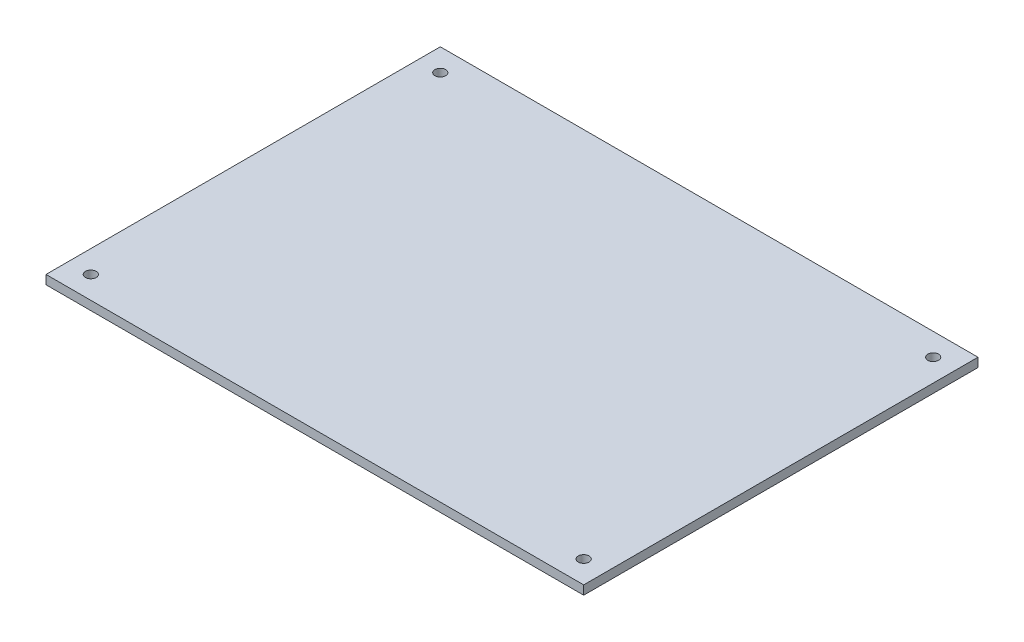
ISO-10303-21;
HEADER;
FILE_DESCRIPTION(('STEP AP214'),'2;1');
FILE_NAME('part.step','',(''),(''),'','','');
FILE_SCHEMA(('AUTOMOTIVE_DESIGN { 1 0 10303 214 1 1 1 1 }'));
ENDSEC;
DATA;
#1=APPLICATION_CONTEXT('core data for automotive mechanical design processes');
#2=APPLICATION_PROTOCOL_DEFINITION('international standard','automotive_design',2000,#1);
#3=PRODUCT_CONTEXT('',#1,'mechanical');
#4=PRODUCT('Part','Part','',(#3));
#5=PRODUCT_RELATED_PRODUCT_CATEGORY('part','',(#4));
#6=PRODUCT_DEFINITION_FORMATION('','',#4);
#7=PRODUCT_DEFINITION_CONTEXT('part definition',#1,'design');
#8=PRODUCT_DEFINITION('design','',#6,#7);
#9=PRODUCT_DEFINITION_SHAPE('','',#8);
#10=(LENGTH_UNIT() NAMED_UNIT(*) SI_UNIT(.MILLI.,.METRE.));
#11=(NAMED_UNIT(*) PLANE_ANGLE_UNIT() SI_UNIT($,.RADIAN.));
#12=(NAMED_UNIT(*) SI_UNIT($,.STERADIAN.) SOLID_ANGLE_UNIT());
#13=UNCERTAINTY_MEASURE_WITH_UNIT(LENGTH_MEASURE(1.E-05),#10,'distance_accuracy_value','');
#14=(GEOMETRIC_REPRESENTATION_CONTEXT(3) GLOBAL_UNCERTAINTY_ASSIGNED_CONTEXT((#13)) GLOBAL_UNIT_ASSIGNED_CONTEXT((#10,
#11,#12)) REPRESENTATION_CONTEXT('',''));
#15=CARTESIAN_POINT('',(0.,0.,0.));
#16=DIRECTION('',(0.,0.,1.));
#17=DIRECTION('',(1.,0.,0.));
#18=AXIS2_PLACEMENT_3D('',#15,#16,#17);
#19=CARTESIAN_POINT('',(150.,5.,-110.));
#20=DIRECTION('',(-1.,0.,0.));
#21=DIRECTION('',(0.,0.,1.));
#22=AXIS2_PLACEMENT_3D('',#19,#20,#21);
#23=PLANE('',#22);
#24=DIRECTION('',(0.,0.,-1.));
#25=VECTOR('',#24,1.);
#26=CARTESIAN_POINT('',(150.,0.,-110.));
#27=LINE('',#26,#25);
#28=CARTESIAN_POINT('',(150.,0.,110.));
#29=VERTEX_POINT('',#28);
#30=CARTESIAN_POINT('',(150.,0.,-110.));
#31=VERTEX_POINT('',#30);
#32=EDGE_CURVE('E103',#29,#31,#27,.T.);
#33=ORIENTED_EDGE('',*,*,#32,.T.);
#34=DIRECTION('',(0.,-1.,0.));
#35=VECTOR('',#34,1.);
#36=CARTESIAN_POINT('',(150.,5.,-110.));
#37=LINE('',#36,#35);
#38=CARTESIAN_POINT('',(150.,5.,-110.));
#39=VERTEX_POINT('',#38);
#40=EDGE_CURVE('E11',#39,#31,#37,.T.);
#41=ORIENTED_EDGE('',*,*,#40,.F.);
#42=DIRECTION('',(0.,0.,-1.));
#43=VECTOR('',#42,1.);
#44=CARTESIAN_POINT('',(150.,5.,-110.));
#45=LINE('',#44,#43);
#46=CARTESIAN_POINT('',(150.,5.,110.));
#47=VERTEX_POINT('',#46);
#48=EDGE_CURVE('E90',#47,#39,#45,.T.);
#49=ORIENTED_EDGE('',*,*,#48,.F.);
#50=DIRECTION('',(0.,-1.,0.));
#51=VECTOR('',#50,1.);
#52=CARTESIAN_POINT('',(150.,5.,110.));
#53=LINE('',#52,#51);
#54=EDGE_CURVE('E99',#47,#29,#53,.T.);
#55=ORIENTED_EDGE('',*,*,#54,.T.);
#56=EDGE_LOOP('',(#33,#41,#49,#55));
#57=FACE_BOUND('',#56,.T.);
#58=ADVANCED_FACE('F37',(#57),#23,.F.);
#59=CARTESIAN_POINT('',(-150.,5.,-110.));
#60=DIRECTION('',(0.,0.,1.));
#61=DIRECTION('',(1.,0.,0.));
#62=AXIS2_PLACEMENT_3D('',#59,#60,#61);
#63=PLANE('',#62);
#64=DIRECTION('',(-1.,0.,0.));
#65=VECTOR('',#64,1.);
#66=CARTESIAN_POINT('',(-150.,0.,-110.));
#67=LINE('',#66,#65);
#68=CARTESIAN_POINT('',(-150.,0.,-110.));
#69=VERTEX_POINT('',#68);
#70=EDGE_CURVE('E94',#31,#69,#67,.T.);
#71=ORIENTED_EDGE('',*,*,#70,.T.);
#72=DIRECTION('',(0.,-1.,0.));
#73=VECTOR('',#72,1.);
#74=CARTESIAN_POINT('',(-150.,5.,-110.));
#75=LINE('',#74,#73);
#76=CARTESIAN_POINT('',(-150.,5.,-110.));
#77=VERTEX_POINT('',#76);
#78=EDGE_CURVE('E46',#77,#69,#75,.T.);
#79=ORIENTED_EDGE('',*,*,#78,.F.);
#80=DIRECTION('',(-1.,0.,0.));
#81=VECTOR('',#80,1.);
#82=CARTESIAN_POINT('',(-150.,5.,-110.));
#83=LINE('',#82,#81);
#84=EDGE_CURVE('E85',#39,#77,#83,.T.);
#85=ORIENTED_EDGE('',*,*,#84,.F.);
#86=ORIENTED_EDGE('',*,*,#40,.T.);
#87=EDGE_LOOP('',(#71,#79,#85,#86));
#88=FACE_BOUND('',#87,.T.);
#89=ADVANCED_FACE('F93',(#88),#63,.F.);
#90=CARTESIAN_POINT('',(-150.,5.,-110.));
#91=DIRECTION('',(1.,0.,0.));
#92=DIRECTION('',(0.,0.,-1.));
#93=AXIS2_PLACEMENT_3D('',#90,#91,#92);
#94=PLANE('',#93);
#95=DIRECTION('',(0.,0.,1.));
#96=VECTOR('',#95,1.);
#97=CARTESIAN_POINT('',(-150.,0.,-110.));
#98=LINE('',#97,#96);
#99=CARTESIAN_POINT('',(-150.,0.,110.));
#100=VERTEX_POINT('',#99);
#101=EDGE_CURVE('E72',#69,#100,#98,.T.);
#102=ORIENTED_EDGE('',*,*,#101,.T.);
#103=DIRECTION('',(0.,-1.,0.));
#104=VECTOR('',#103,1.);
#105=CARTESIAN_POINT('',(-150.,5.,110.));
#106=LINE('',#105,#104);
#107=CARTESIAN_POINT('',(-150.,5.,110.));
#108=VERTEX_POINT('',#107);
#109=EDGE_CURVE('E95',#108,#100,#106,.T.);
#110=ORIENTED_EDGE('',*,*,#109,.F.);
#111=DIRECTION('',(0.,0.,1.));
#112=VECTOR('',#111,1.);
#113=CARTESIAN_POINT('',(-150.,5.,-110.));
#114=LINE('',#113,#112);
#115=EDGE_CURVE('E88',#77,#108,#114,.T.);
#116=ORIENTED_EDGE('',*,*,#115,.F.);
#117=ORIENTED_EDGE('',*,*,#78,.T.);
#118=EDGE_LOOP('',(#102,#110,#116,#117));
#119=FACE_BOUND('',#118,.T.);
#120=ADVANCED_FACE('F97',(#119),#94,.F.);
#121=CARTESIAN_POINT('',(-150.,5.,110.));
#122=DIRECTION('',(0.,0.,-1.));
#123=DIRECTION('',(-1.,0.,0.));
#124=AXIS2_PLACEMENT_3D('',#121,#122,#123);
#125=PLANE('',#124);
#126=DIRECTION('',(1.,0.,0.));
#127=VECTOR('',#126,1.);
#128=CARTESIAN_POINT('',(-150.,0.,110.));
#129=LINE('',#128,#127);
#130=EDGE_CURVE('E78',#100,#29,#129,.T.);
#131=ORIENTED_EDGE('',*,*,#130,.T.);
#132=ORIENTED_EDGE('',*,*,#54,.F.);
#133=DIRECTION('',(1.,0.,0.));
#134=VECTOR('',#133,1.);
#135=CARTESIAN_POINT('',(-150.,5.,110.));
#136=LINE('',#135,#134);
#137=EDGE_CURVE('E55',#108,#47,#136,.T.);
#138=ORIENTED_EDGE('',*,*,#137,.F.);
#139=ORIENTED_EDGE('',*,*,#109,.T.);
#140=EDGE_LOOP('',(#131,#132,#138,#139));
#141=FACE_BOUND('',#140,.T.);
#142=ADVANCED_FACE('F151',(#141),#125,.F.);
#143=CARTESIAN_POINT('',(0.,5.,0.));
#144=DIRECTION('',(0.,1.,0.));
#145=DIRECTION('',(0.,0.,1.));
#146=AXIS2_PLACEMENT_3D('',#143,#144,#145);
#147=PLANE('',#146);
#148=CARTESIAN_POINT('',(-137.5,5.,97.5));
#149=DIRECTION('',(0.,1.,0.));
#150=DIRECTION('',(0.,0.,1.));
#151=AXIS2_PLACEMENT_3D('',#148,#149,#150);
#152=CIRCLE('',#151,3.);
#153=CARTESIAN_POINT('',(-137.5,5.,100.5));
#154=VERTEX_POINT('',#153);
#155=EDGE_CURVE('E40',#154,#154,#152,.T.);
#156=ORIENTED_EDGE('',*,*,#155,.F.);
#157=EDGE_LOOP('',(#156));
#158=FACE_BOUND('',#157,.T.);
#159=CARTESIAN_POINT('',(-137.5,5.,-97.5));
#160=DIRECTION('',(0.,1.,0.));
#161=DIRECTION('',(0.,0.,1.));
#162=AXIS2_PLACEMENT_3D('',#159,#160,#161);
#163=CIRCLE('',#162,3.);
#164=CARTESIAN_POINT('',(-137.5,5.,-94.5));
#165=VERTEX_POINT('',#164);
#166=EDGE_CURVE('E116',#165,#165,#163,.T.);
#167=ORIENTED_EDGE('',*,*,#166,.F.);
#168=EDGE_LOOP('',(#167));
#169=FACE_BOUND('',#168,.T.);
#170=CARTESIAN_POINT('',(137.5,5.,-97.5));
#171=DIRECTION('',(0.,1.,0.));
#172=DIRECTION('',(0.,0.,1.));
#173=AXIS2_PLACEMENT_3D('',#170,#171,#172);
#174=CIRCLE('',#173,3.);
#175=CARTESIAN_POINT('',(137.5,5.,-94.5));
#176=VERTEX_POINT('',#175);
#177=EDGE_CURVE('E112',#176,#176,#174,.T.);
#178=ORIENTED_EDGE('',*,*,#177,.F.);
#179=EDGE_LOOP('',(#178));
#180=FACE_BOUND('',#179,.T.);
#181=CARTESIAN_POINT('',(137.5,5.,97.5));
#182=DIRECTION('',(0.,1.,0.));
#183=DIRECTION('',(0.,0.,1.));
#184=AXIS2_PLACEMENT_3D('',#181,#182,#183);
#185=CIRCLE('',#184,3.);
#186=CARTESIAN_POINT('',(137.5,5.,100.5));
#187=VERTEX_POINT('',#186);
#188=EDGE_CURVE('E133',#187,#187,#185,.T.);
#189=ORIENTED_EDGE('',*,*,#188,.F.);
#190=EDGE_LOOP('',(#189));
#191=FACE_BOUND('',#190,.T.);
#192=ORIENTED_EDGE('',*,*,#48,.T.);
#193=ORIENTED_EDGE('',*,*,#84,.T.);
#194=ORIENTED_EDGE('',*,*,#115,.T.);
#195=ORIENTED_EDGE('',*,*,#137,.T.);
#196=EDGE_LOOP('',(#192,#193,#194,#195));
#197=FACE_BOUND('',#196,.T.);
#198=ADVANCED_FACE('F86',(#158,#169,#180,#191,#197),#147,.T.);
#199=CARTESIAN_POINT('',(0.,0.,0.));
#200=DIRECTION('',(0.,1.,0.));
#201=DIRECTION('',(0.,0.,1.));
#202=AXIS2_PLACEMENT_3D('',#199,#200,#201);
#203=PLANE('',#202);
#204=CARTESIAN_POINT('',(-137.5,0.,97.5));
#205=DIRECTION('',(0.,-1.,0.));
#206=DIRECTION('',(0.,0.,-1.));
#207=AXIS2_PLACEMENT_3D('',#204,#205,#206);
#208=CIRCLE('',#207,3.);
#209=CARTESIAN_POINT('',(-137.5,0.,94.5));
#210=VERTEX_POINT('',#209);
#211=EDGE_CURVE('E128',#210,#210,#208,.T.);
#212=ORIENTED_EDGE('',*,*,#211,.F.);
#213=EDGE_LOOP('',(#212));
#214=FACE_BOUND('',#213,.T.);
#215=CARTESIAN_POINT('',(-137.5,0.,-97.5));
#216=DIRECTION('',(0.,-1.,0.));
#217=DIRECTION('',(0.,0.,-1.));
#218=AXIS2_PLACEMENT_3D('',#215,#216,#217);
#219=CIRCLE('',#218,3.);
#220=CARTESIAN_POINT('',(-137.5,0.,-100.5));
#221=VERTEX_POINT('',#220);
#222=EDGE_CURVE('E118',#221,#221,#219,.T.);
#223=ORIENTED_EDGE('',*,*,#222,.F.);
#224=EDGE_LOOP('',(#223));
#225=FACE_BOUND('',#224,.T.);
#226=CARTESIAN_POINT('',(137.5,0.,-97.5));
#227=DIRECTION('',(0.,-1.,0.));
#228=DIRECTION('',(0.,0.,-1.));
#229=AXIS2_PLACEMENT_3D('',#226,#227,#228);
#230=CIRCLE('',#229,3.);
#231=CARTESIAN_POINT('',(137.5,0.,-100.5));
#232=VERTEX_POINT('',#231);
#233=EDGE_CURVE('E115',#232,#232,#230,.T.);
#234=ORIENTED_EDGE('',*,*,#233,.F.);
#235=EDGE_LOOP('',(#234));
#236=FACE_BOUND('',#235,.T.);
#237=CARTESIAN_POINT('',(137.5,0.,97.5));
#238=DIRECTION('',(0.,-1.,0.));
#239=DIRECTION('',(0.,0.,-1.));
#240=AXIS2_PLACEMENT_3D('',#237,#238,#239);
#241=CIRCLE('',#240,3.);
#242=CARTESIAN_POINT('',(137.5,0.,94.5));
#243=VERTEX_POINT('',#242);
#244=EDGE_CURVE('E114',#243,#243,#241,.T.);
#245=ORIENTED_EDGE('',*,*,#244,.F.);
#246=EDGE_LOOP('',(#245));
#247=FACE_BOUND('',#246,.T.);
#248=CARTESIAN_POINT('',(-55.,0.,0.));
#249=DIRECTION('',(0.,-1.,0.));
#250=DIRECTION('',(0.,0.,-1.));
#251=AXIS2_PLACEMENT_3D('',#248,#249,#250);
#252=CIRCLE('',#251,12.5);
#253=CARTESIAN_POINT('',(-55.,0.,-12.5));
#254=VERTEX_POINT('',#253);
#255=EDGE_CURVE('E136',#254,#254,#252,.T.);
#256=ORIENTED_EDGE('',*,*,#255,.F.);
#257=EDGE_LOOP('',(#256));
#258=FACE_BOUND('',#257,.T.);
#259=ORIENTED_EDGE('',*,*,#32,.F.);
#260=ORIENTED_EDGE('',*,*,#130,.F.);
#261=ORIENTED_EDGE('',*,*,#101,.F.);
#262=ORIENTED_EDGE('',*,*,#70,.F.);
#263=EDGE_LOOP('',(#259,#260,#261,#262));
#264=FACE_BOUND('',#263,.T.);
#265=ADVANCED_FACE('F144',(#214,#225,#236,#247,#258,#264),#203,.F.);
#266=CARTESIAN_POINT('',(-55.,1.,0.));
#267=DIRECTION('',(0.,-1.,0.));
#268=DIRECTION('',(0.,0.,-1.));
#269=AXIS2_PLACEMENT_3D('',#266,#267,#268);
#270=CYLINDRICAL_SURFACE('',#269,12.5);
#271=CARTESIAN_POINT('',(-55.,1.,0.));
#272=DIRECTION('',(0.,-1.,0.));
#273=DIRECTION('',(0.,0.,-1.));
#274=AXIS2_PLACEMENT_3D('',#271,#272,#273);
#275=CIRCLE('',#274,12.5);
#276=CARTESIAN_POINT('',(-55.,1.,-12.5));
#277=VERTEX_POINT('',#276);
#278=EDGE_CURVE('E106',#277,#277,#275,.T.);
#279=ORIENTED_EDGE('',*,*,#278,.F.);
#280=EDGE_LOOP('',(#279));
#281=FACE_BOUND('',#280,.T.);
#282=ORIENTED_EDGE('',*,*,#255,.T.);
#283=EDGE_LOOP('',(#282));
#284=FACE_BOUND('',#283,.T.);
#285=ADVANCED_FACE('F142',(#281,#284),#270,.F.);
#286=CARTESIAN_POINT('',(-55.,1.,0.));
#287=DIRECTION('',(0.,-1.,0.));
#288=DIRECTION('',(0.,0.,-1.));
#289=AXIS2_PLACEMENT_3D('',#286,#287,#288);
#290=PLANE('',#289);
#291=ORIENTED_EDGE('',*,*,#278,.T.);
#292=EDGE_LOOP('',(#291));
#293=FACE_BOUND('',#292,.T.);
#294=ADVANCED_FACE('F186',(#293),#290,.T.);
#295=CARTESIAN_POINT('',(137.5,0.,97.5));
#296=DIRECTION('',(0.,-1.,0.));
#297=DIRECTION('',(0.,0.,-1.));
#298=AXIS2_PLACEMENT_3D('',#295,#296,#297);
#299=CYLINDRICAL_SURFACE('',#298,3.);
#300=ORIENTED_EDGE('',*,*,#188,.T.);
#301=EDGE_LOOP('',(#300));
#302=FACE_BOUND('',#301,.T.);
#303=ORIENTED_EDGE('',*,*,#244,.T.);
#304=EDGE_LOOP('',(#303));
#305=FACE_BOUND('',#304,.T.);
#306=ADVANCED_FACE('F197',(#302,#305),#299,.F.);
#307=CARTESIAN_POINT('',(137.5,0.,-97.5));
#308=DIRECTION('',(0.,-1.,0.));
#309=DIRECTION('',(0.,0.,-1.));
#310=AXIS2_PLACEMENT_3D('',#307,#308,#309);
#311=CYLINDRICAL_SURFACE('',#310,3.);
#312=ORIENTED_EDGE('',*,*,#177,.T.);
#313=EDGE_LOOP('',(#312));
#314=FACE_BOUND('',#313,.T.);
#315=ORIENTED_EDGE('',*,*,#233,.T.);
#316=EDGE_LOOP('',(#315));
#317=FACE_BOUND('',#316,.T.);
#318=ADVANCED_FACE('F212',(#314,#317),#311,.F.);
#319=CARTESIAN_POINT('',(-137.5,0.,-97.5));
#320=DIRECTION('',(0.,-1.,0.));
#321=DIRECTION('',(0.,0.,-1.));
#322=AXIS2_PLACEMENT_3D('',#319,#320,#321);
#323=CYLINDRICAL_SURFACE('',#322,3.);
#324=ORIENTED_EDGE('',*,*,#166,.T.);
#325=EDGE_LOOP('',(#324));
#326=FACE_BOUND('',#325,.T.);
#327=ORIENTED_EDGE('',*,*,#222,.T.);
#328=EDGE_LOOP('',(#327));
#329=FACE_BOUND('',#328,.T.);
#330=ADVANCED_FACE('F222',(#326,#329),#323,.F.);
#331=CARTESIAN_POINT('',(-137.5,0.,97.5));
#332=DIRECTION('',(0.,-1.,0.));
#333=DIRECTION('',(0.,0.,-1.));
#334=AXIS2_PLACEMENT_3D('',#331,#332,#333);
#335=CYLINDRICAL_SURFACE('',#334,3.);
#336=ORIENTED_EDGE('',*,*,#155,.T.);
#337=EDGE_LOOP('',(#336));
#338=FACE_BOUND('',#337,.T.);
#339=ORIENTED_EDGE('',*,*,#211,.T.);
#340=EDGE_LOOP('',(#339));
#341=FACE_BOUND('',#340,.T.);
#342=ADVANCED_FACE('F232',(#338,#341),#335,.F.);
#343=CLOSED_SHELL('',(#58,#89,#120,#142,#198,#265,#285,#294,#306,#318,#330,#342));
#344=MANIFOLD_SOLID_BREP('B2',#343);
#345=ADVANCED_BREP_SHAPE_REPRESENTATION('',(#18,#344),#14);
#346=SHAPE_DEFINITION_REPRESENTATION(#9,#345);
ENDSEC;
END-ISO-10303-21;
